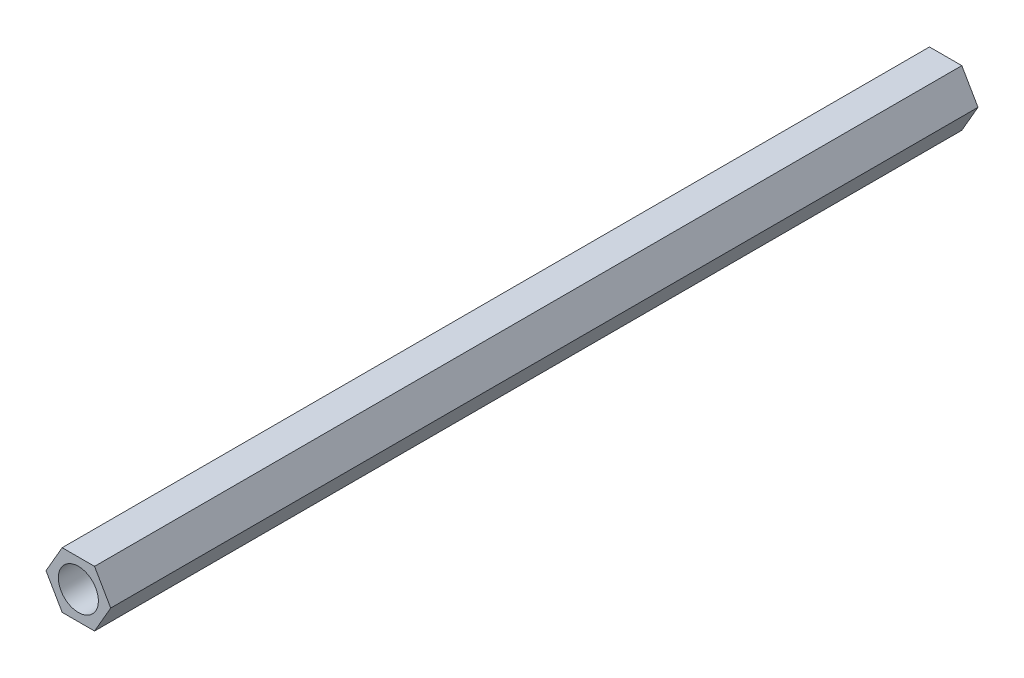
ISO-10303-21;
HEADER;
FILE_DESCRIPTION(('STEP AP214'),'2;1');
FILE_NAME('part.step','',(''),(''),'','','');
FILE_SCHEMA(('AUTOMOTIVE_DESIGN { 1 0 10303 214 1 1 1 1 }'));
ENDSEC;
DATA;
#1=APPLICATION_CONTEXT('core data for automotive mechanical design processes');
#2=APPLICATION_PROTOCOL_DEFINITION('international standard','automotive_design',2000,#1);
#3=PRODUCT_CONTEXT('',#1,'mechanical');
#4=PRODUCT('Part','Part','',(#3));
#5=PRODUCT_RELATED_PRODUCT_CATEGORY('part','',(#4));
#6=PRODUCT_DEFINITION_FORMATION('','',#4);
#7=PRODUCT_DEFINITION_CONTEXT('part definition',#1,'design');
#8=PRODUCT_DEFINITION('design','',#6,#7);
#9=PRODUCT_DEFINITION_SHAPE('','',#8);
#10=(LENGTH_UNIT() NAMED_UNIT(*) SI_UNIT(.MILLI.,.METRE.));
#11=(NAMED_UNIT(*) PLANE_ANGLE_UNIT() SI_UNIT($,.RADIAN.));
#12=(NAMED_UNIT(*) SI_UNIT($,.STERADIAN.) SOLID_ANGLE_UNIT());
#13=UNCERTAINTY_MEASURE_WITH_UNIT(LENGTH_MEASURE(1.E-05),#10,'distance_accuracy_value','');
#14=(GEOMETRIC_REPRESENTATION_CONTEXT(3) GLOBAL_UNCERTAINTY_ASSIGNED_CONTEXT((#13)) GLOBAL_UNIT_ASSIGNED_CONTEXT((#10,
#11,#12)) REPRESENTATION_CONTEXT('',''));
#15=CARTESIAN_POINT('',(0.,0.,0.));
#16=DIRECTION('',(0.,0.,1.));
#17=DIRECTION('',(1.,0.,0.));
#18=AXIS2_PLACEMENT_3D('',#15,#16,#17);
#19=CARTESIAN_POINT('',(0.,0.,65.));
#20=DIRECTION('',(0.,0.,1.));
#21=DIRECTION('',(1.,0.,0.));
#22=AXIS2_PLACEMENT_3D('',#19,#20,#21);
#23=PLANE('',#22);
#24=DIRECTION('',(0.5,0.866025403784438,0.));
#25=VECTOR('',#24,1.);
#26=CARTESIAN_POINT('',(1.21243556529822,-2.1,65.));
#27=LINE('',#26,#25);
#28=CARTESIAN_POINT('',(1.21243556529822,-2.1,65.));
#29=VERTEX_POINT('',#28);
#30=CARTESIAN_POINT('',(2.42487113059643,0.,65.));
#31=VERTEX_POINT('',#30);
#32=EDGE_CURVE('E134',#29,#31,#27,.T.);
#33=ORIENTED_EDGE('',*,*,#32,.T.);
#34=DIRECTION('',(-0.5,0.866025403784438,0.));
#35=VECTOR('',#34,1.);
#36=CARTESIAN_POINT('',(2.42487113059643,0.,65.));
#37=LINE('',#36,#35);
#38=CARTESIAN_POINT('',(1.21243556529821,2.1,65.));
#39=VERTEX_POINT('',#38);
#40=EDGE_CURVE('E92',#31,#39,#37,.T.);
#41=ORIENTED_EDGE('',*,*,#40,.T.);
#42=DIRECTION('',(-1.,0.,0.));
#43=VECTOR('',#42,1.);
#44=CARTESIAN_POINT('',(1.21243556529821,2.1,65.));
#45=LINE('',#44,#43);
#46=CARTESIAN_POINT('',(-1.21243556529821,2.1,65.));
#47=VERTEX_POINT('',#46);
#48=EDGE_CURVE('E105',#39,#47,#45,.T.);
#49=ORIENTED_EDGE('',*,*,#48,.T.);
#50=DIRECTION('',(-0.5,-0.866025403784438,0.));
#51=VECTOR('',#50,1.);
#52=CARTESIAN_POINT('',(-1.21243556529821,2.1,65.));
#53=LINE('',#52,#51);
#54=CARTESIAN_POINT('',(-2.42487113059643,0.,65.));
#55=VERTEX_POINT('',#54);
#56=EDGE_CURVE('E99',#47,#55,#53,.T.);
#57=ORIENTED_EDGE('',*,*,#56,.T.);
#58=DIRECTION('',(0.5,-0.866025403784438,0.));
#59=VECTOR('',#58,1.);
#60=CARTESIAN_POINT('',(-2.42487113059643,0.,65.));
#61=LINE('',#60,#59);
#62=CARTESIAN_POINT('',(-1.21243556529821,-2.1,65.));
#63=VERTEX_POINT('',#62);
#64=EDGE_CURVE('E103',#55,#63,#61,.T.);
#65=ORIENTED_EDGE('',*,*,#64,.T.);
#66=DIRECTION('',(1.,0.,0.));
#67=VECTOR('',#66,1.);
#68=CARTESIAN_POINT('',(-1.21243556529821,-2.1,65.));
#69=LINE('',#68,#67);
#70=EDGE_CURVE('E55',#63,#29,#69,.T.);
#71=ORIENTED_EDGE('',*,*,#70,.T.);
#72=EDGE_LOOP('',(#33,#41,#49,#57,#65,#71));
#73=FACE_BOUND('',#72,.T.);
#74=CARTESIAN_POINT('',(0.,0.,65.));
#75=DIRECTION('',(0.,0.,1.));
#76=DIRECTION('',(1.,0.,0.));
#77=AXIS2_PLACEMENT_3D('',#74,#75,#76);
#78=CIRCLE('',#77,1.5);
#79=CARTESIAN_POINT('',(1.5,0.,65.));
#80=VERTEX_POINT('',#79);
#81=EDGE_CURVE('E127',#80,#80,#78,.T.);
#82=ORIENTED_EDGE('',*,*,#81,.F.);
#83=EDGE_LOOP('',(#82));
#84=FACE_BOUND('',#83,.T.);
#85=ADVANCED_FACE('F38',(#73,#84),#23,.T.);
#86=CARTESIAN_POINT('',(0.,0.,0.));
#87=DIRECTION('',(0.,0.,1.));
#88=DIRECTION('',(1.,0.,0.));
#89=AXIS2_PLACEMENT_3D('',#86,#87,#88);
#90=PLANE('',#89);
#91=DIRECTION('',(0.5,0.866025403784438,0.));
#92=VECTOR('',#91,1.);
#93=CARTESIAN_POINT('',(1.21243556529822,-2.1,0.));
#94=LINE('',#93,#92);
#95=CARTESIAN_POINT('',(1.21243556529822,-2.1,0.));
#96=VERTEX_POINT('',#95);
#97=CARTESIAN_POINT('',(2.42487113059643,0.,0.));
#98=VERTEX_POINT('',#97);
#99=EDGE_CURVE('E123',#96,#98,#94,.T.);
#100=ORIENTED_EDGE('',*,*,#99,.F.);
#101=DIRECTION('',(1.,0.,0.));
#102=VECTOR('',#101,1.);
#103=CARTESIAN_POINT('',(-1.21243556529821,-2.1,0.));
#104=LINE('',#103,#102);
#105=CARTESIAN_POINT('',(-1.21243556529821,-2.1,0.));
#106=VERTEX_POINT('',#105);
#107=EDGE_CURVE('E84',#106,#96,#104,.T.);
#108=ORIENTED_EDGE('',*,*,#107,.F.);
#109=DIRECTION('',(0.5,-0.866025403784438,0.));
#110=VECTOR('',#109,1.);
#111=CARTESIAN_POINT('',(-2.42487113059643,0.,0.));
#112=LINE('',#111,#110);
#113=CARTESIAN_POINT('',(-2.42487113059643,0.,0.));
#114=VERTEX_POINT('',#113);
#115=EDGE_CURVE('E78',#114,#106,#112,.T.);
#116=ORIENTED_EDGE('',*,*,#115,.F.);
#117=DIRECTION('',(-0.5,-0.866025403784438,0.));
#118=VECTOR('',#117,1.);
#119=CARTESIAN_POINT('',(-1.21243556529821,2.1,0.));
#120=LINE('',#119,#118);
#121=CARTESIAN_POINT('',(-1.21243556529821,2.1,0.));
#122=VERTEX_POINT('',#121);
#123=EDGE_CURVE('E113',#122,#114,#120,.T.);
#124=ORIENTED_EDGE('',*,*,#123,.F.);
#125=DIRECTION('',(-1.,0.,0.));
#126=VECTOR('',#125,1.);
#127=CARTESIAN_POINT('',(1.21243556529821,2.1,0.));
#128=LINE('',#127,#126);
#129=CARTESIAN_POINT('',(1.21243556529821,2.1,0.));
#130=VERTEX_POINT('',#129);
#131=EDGE_CURVE('E129',#130,#122,#128,.T.);
#132=ORIENTED_EDGE('',*,*,#131,.F.);
#133=DIRECTION('',(-0.5,0.866025403784438,0.));
#134=VECTOR('',#133,1.);
#135=CARTESIAN_POINT('',(2.42487113059643,0.,0.));
#136=LINE('',#135,#134);
#137=EDGE_CURVE('E126',#98,#130,#136,.T.);
#138=ORIENTED_EDGE('',*,*,#137,.F.);
#139=EDGE_LOOP('',(#100,#108,#116,#124,#132,#138));
#140=FACE_BOUND('',#139,.T.);
#141=CARTESIAN_POINT('',(0.,0.,0.));
#142=DIRECTION('',(0.,0.,1.));
#143=DIRECTION('',(1.,0.,0.));
#144=AXIS2_PLACEMENT_3D('',#141,#142,#143);
#145=CIRCLE('',#144,1.5);
#146=CARTESIAN_POINT('',(1.5,0.,0.));
#147=VERTEX_POINT('',#146);
#148=EDGE_CURVE('E227',#147,#147,#145,.T.);
#149=ORIENTED_EDGE('',*,*,#148,.T.);
#150=EDGE_LOOP('',(#149));
#151=FACE_BOUND('',#150,.T.);
#152=ADVANCED_FACE('F143',(#140,#151),#90,.F.);
#153=CARTESIAN_POINT('',(1.21243556529822,-2.1,65.));
#154=DIRECTION('',(-0.866025403784439,0.5,0.));
#155=DIRECTION('',(-0.5,-0.866025403784439,0.));
#156=AXIS2_PLACEMENT_3D('',#153,#154,#155);
#157=PLANE('',#156);
#158=ORIENTED_EDGE('',*,*,#99,.T.);
#159=DIRECTION('',(0.,0.,-1.));
#160=VECTOR('',#159,1.);
#161=CARTESIAN_POINT('',(2.42487113059643,0.,65.));
#162=LINE('',#161,#160);
#163=EDGE_CURVE('E11',#31,#98,#162,.T.);
#164=ORIENTED_EDGE('',*,*,#163,.F.);
#165=ORIENTED_EDGE('',*,*,#32,.F.);
#166=DIRECTION('',(0.,0.,-1.));
#167=VECTOR('',#166,1.);
#168=CARTESIAN_POINT('',(1.21243556529822,-2.1,65.));
#169=LINE('',#168,#167);
#170=EDGE_CURVE('E119',#29,#96,#169,.T.);
#171=ORIENTED_EDGE('',*,*,#170,.T.);
#172=EDGE_LOOP('',(#158,#164,#165,#171));
#173=FACE_BOUND('',#172,.T.);
#174=ADVANCED_FACE('F40',(#173),#157,.F.);
#175=CARTESIAN_POINT('',(2.42487113059643,0.,65.));
#176=DIRECTION('',(-0.866025403784438,-0.5,0.));
#177=DIRECTION('',(0.5,-0.866025403784438,0.));
#178=AXIS2_PLACEMENT_3D('',#175,#176,#177);
#179=PLANE('',#178);
#180=ORIENTED_EDGE('',*,*,#137,.T.);
#181=DIRECTION('',(0.,0.,-1.));
#182=VECTOR('',#181,1.);
#183=CARTESIAN_POINT('',(1.21243556529821,2.1,65.));
#184=LINE('',#183,#182);
#185=EDGE_CURVE('E47',#39,#130,#184,.T.);
#186=ORIENTED_EDGE('',*,*,#185,.F.);
#187=ORIENTED_EDGE('',*,*,#40,.F.);
#188=ORIENTED_EDGE('',*,*,#163,.T.);
#189=EDGE_LOOP('',(#180,#186,#187,#188));
#190=FACE_BOUND('',#189,.T.);
#191=ADVANCED_FACE('F168',(#190),#179,.F.);
#192=CARTESIAN_POINT('',(1.21243556529821,2.1,65.));
#193=DIRECTION('',(0.,-1.,0.));
#194=DIRECTION('',(1.,0.,0.));
#195=AXIS2_PLACEMENT_3D('',#192,#193,#194);
#196=PLANE('',#195);
#197=ORIENTED_EDGE('',*,*,#131,.T.);
#198=DIRECTION('',(0.,0.,-1.));
#199=VECTOR('',#198,1.);
#200=CARTESIAN_POINT('',(-1.21243556529821,2.1,65.));
#201=LINE('',#200,#199);
#202=EDGE_CURVE('E114',#47,#122,#201,.T.);
#203=ORIENTED_EDGE('',*,*,#202,.F.);
#204=ORIENTED_EDGE('',*,*,#48,.F.);
#205=ORIENTED_EDGE('',*,*,#185,.T.);
#206=EDGE_LOOP('',(#197,#203,#204,#205));
#207=FACE_BOUND('',#206,.T.);
#208=ADVANCED_FACE('F140',(#207),#196,.F.);
#209=CARTESIAN_POINT('',(-1.21243556529821,2.1,65.));
#210=DIRECTION('',(0.866025403784438,-0.5,0.));
#211=DIRECTION('',(0.5,0.866025403784439,0.));
#212=AXIS2_PLACEMENT_3D('',#209,#210,#211);
#213=PLANE('',#212);
#214=ORIENTED_EDGE('',*,*,#123,.T.);
#215=DIRECTION('',(0.,0.,-1.));
#216=VECTOR('',#215,1.);
#217=CARTESIAN_POINT('',(-2.42487113059643,0.,65.));
#218=LINE('',#217,#216);
#219=EDGE_CURVE('E110',#55,#114,#218,.T.);
#220=ORIENTED_EDGE('',*,*,#219,.F.);
#221=ORIENTED_EDGE('',*,*,#56,.F.);
#222=ORIENTED_EDGE('',*,*,#202,.T.);
#223=EDGE_LOOP('',(#214,#220,#221,#222));
#224=FACE_BOUND('',#223,.T.);
#225=ADVANCED_FACE('F111',(#224),#213,.F.);
#226=CARTESIAN_POINT('',(-2.42487113059643,0.,65.));
#227=DIRECTION('',(0.866025403784439,0.5,0.));
#228=DIRECTION('',(-0.5,0.866025403784439,0.));
#229=AXIS2_PLACEMENT_3D('',#226,#227,#228);
#230=PLANE('',#229);
#231=ORIENTED_EDGE('',*,*,#115,.T.);
#232=DIRECTION('',(0.,0.,-1.));
#233=VECTOR('',#232,1.);
#234=CARTESIAN_POINT('',(-1.21243556529821,-2.1,65.));
#235=LINE('',#234,#233);
#236=EDGE_CURVE('E115',#63,#106,#235,.T.);
#237=ORIENTED_EDGE('',*,*,#236,.F.);
#238=ORIENTED_EDGE('',*,*,#64,.F.);
#239=ORIENTED_EDGE('',*,*,#219,.T.);
#240=EDGE_LOOP('',(#231,#237,#238,#239));
#241=FACE_BOUND('',#240,.T.);
#242=ADVANCED_FACE('F117',(#241),#230,.F.);
#243=CARTESIAN_POINT('',(-1.21243556529821,-2.1,65.));
#244=DIRECTION('',(0.,1.,0.));
#245=DIRECTION('',(-1.,0.,0.));
#246=AXIS2_PLACEMENT_3D('',#243,#244,#245);
#247=PLANE('',#246);
#248=ORIENTED_EDGE('',*,*,#107,.T.);
#249=ORIENTED_EDGE('',*,*,#170,.F.);
#250=ORIENTED_EDGE('',*,*,#70,.F.);
#251=ORIENTED_EDGE('',*,*,#236,.T.);
#252=EDGE_LOOP('',(#248,#249,#250,#251));
#253=FACE_BOUND('',#252,.T.);
#254=ADVANCED_FACE('F148',(#253),#247,.F.);
#255=CARTESIAN_POINT('',(0.,0.,65.));
#256=DIRECTION('',(0.,0.,-1.));
#257=DIRECTION('',(-1.,0.,0.));
#258=AXIS2_PLACEMENT_3D('',#255,#256,#257);
#259=CYLINDRICAL_SURFACE('',#258,1.5);
#260=ORIENTED_EDGE('',*,*,#81,.T.);
#261=EDGE_LOOP('',(#260));
#262=FACE_BOUND('',#261,.T.);
#263=ORIENTED_EDGE('',*,*,#148,.F.);
#264=EDGE_LOOP('',(#263));
#265=FACE_BOUND('',#264,.T.);
#266=ADVANCED_FACE('F150',(#262,#265),#259,.F.);
#267=CLOSED_SHELL('',(#85,#152,#174,#191,#208,#225,#242,#254,#266));
#268=MANIFOLD_SOLID_BREP('B2',#267);
#269=ADVANCED_BREP_SHAPE_REPRESENTATION('',(#18,#268),#14);
#270=SHAPE_DEFINITION_REPRESENTATION(#9,#269);
ENDSEC;
END-ISO-10303-21;
